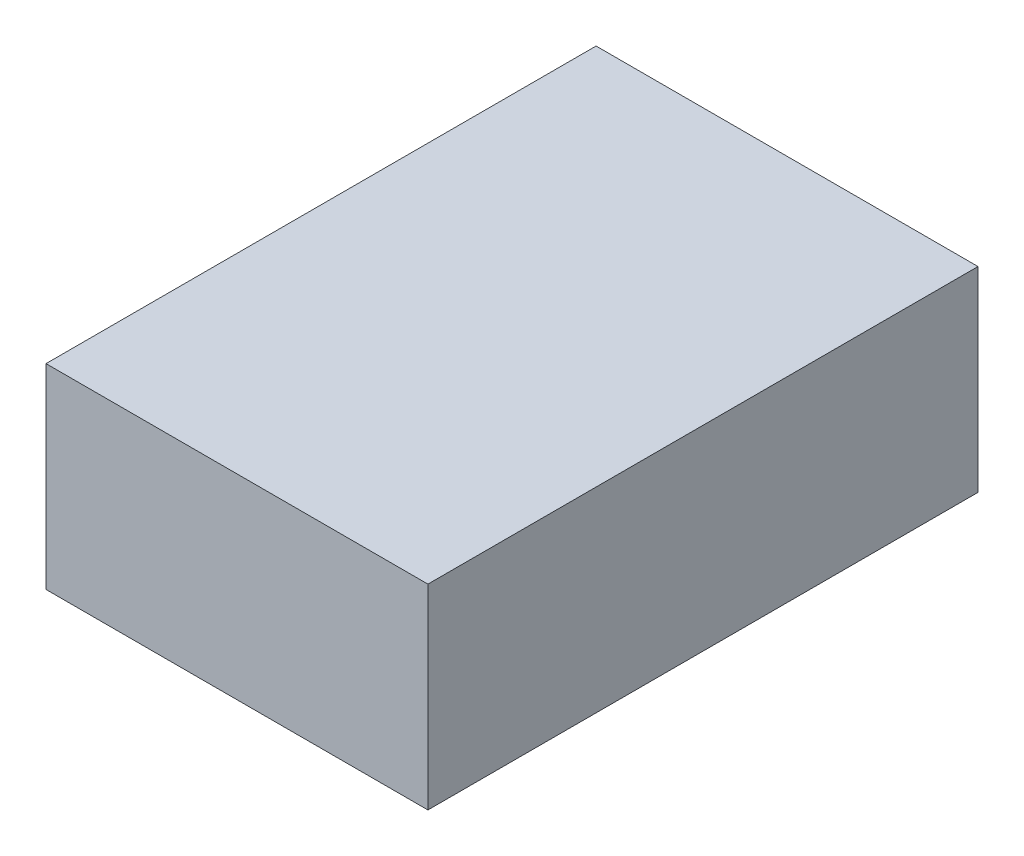
ISO-10303-21;
HEADER;
FILE_DESCRIPTION(('STEP AP214'),'2;1');
FILE_NAME('part.step','',(''),(''),'','','');
FILE_SCHEMA(('AUTOMOTIVE_DESIGN { 1 0 10303 214 1 1 1 1 }'));
ENDSEC;
DATA;
#1=APPLICATION_CONTEXT('core data for automotive mechanical design processes');
#2=APPLICATION_PROTOCOL_DEFINITION('international standard','automotive_design',2000,#1);
#3=PRODUCT_CONTEXT('',#1,'mechanical');
#4=PRODUCT('Part','Part','',(#3));
#5=PRODUCT_RELATED_PRODUCT_CATEGORY('part','',(#4));
#6=PRODUCT_DEFINITION_FORMATION('','',#4);
#7=PRODUCT_DEFINITION_CONTEXT('part definition',#1,'design');
#8=PRODUCT_DEFINITION('design','',#6,#7);
#9=PRODUCT_DEFINITION_SHAPE('','',#8);
#10=(LENGTH_UNIT() NAMED_UNIT(*) SI_UNIT(.MILLI.,.METRE.));
#11=(NAMED_UNIT(*) PLANE_ANGLE_UNIT() SI_UNIT($,.RADIAN.));
#12=(NAMED_UNIT(*) SI_UNIT($,.STERADIAN.) SOLID_ANGLE_UNIT());
#13=UNCERTAINTY_MEASURE_WITH_UNIT(LENGTH_MEASURE(1.E-05),#10,'distance_accuracy_value','');
#14=(GEOMETRIC_REPRESENTATION_CONTEXT(3) GLOBAL_UNCERTAINTY_ASSIGNED_CONTEXT((#13)) GLOBAL_UNIT_ASSIGNED_CONTEXT((#10,
#11,#12)) REPRESENTATION_CONTEXT('',''));
#15=CARTESIAN_POINT('',(0.,0.,0.));
#16=DIRECTION('',(0.,0.,1.));
#17=DIRECTION('',(1.,0.,0.));
#18=AXIS2_PLACEMENT_3D('',#15,#16,#17);
#19=CARTESIAN_POINT('',(-0.5207,0.2667,0.));
#20=DIRECTION('',(0.,1.,0.));
#21=DIRECTION('',(1.,0.,0.));
#22=AXIS2_PLACEMENT_3D('',#19,#20,#21);
#23=PLANE('',#22);
#24=DIRECTION('',(0.,0.,-1.));
#25=VECTOR('',#24,1.);
#26=CARTESIAN_POINT('',(0.5207,0.2667,0.));
#27=LINE('',#26,#25);
#28=CARTESIAN_POINT('',(0.5207,0.2667,1.5));
#29=VERTEX_POINT('',#28);
#30=CARTESIAN_POINT('',(0.5207,0.2667,0.));
#31=VERTEX_POINT('',#30);
#32=EDGE_CURVE('E27',#29,#31,#27,.T.);
#33=ORIENTED_EDGE('',*,*,#32,.T.);
#34=DIRECTION('',(-1.,0.,0.));
#35=VECTOR('',#34,1.);
#36=CARTESIAN_POINT('',(-0.5207,0.2667,0.));
#37=LINE('',#36,#35);
#38=CARTESIAN_POINT('',(-0.5207,0.2667,0.));
#39=VERTEX_POINT('',#38);
#40=EDGE_CURVE('E11',#31,#39,#37,.T.);
#41=ORIENTED_EDGE('',*,*,#40,.T.);
#42=DIRECTION('',(0.,0.,1.));
#43=VECTOR('',#42,1.);
#44=CARTESIAN_POINT('',(-0.5207,0.2667,0.));
#45=LINE('',#44,#43);
#46=CARTESIAN_POINT('',(-0.5207,0.2667,1.5));
#47=VERTEX_POINT('',#46);
#48=EDGE_CURVE('E70',#39,#47,#45,.T.);
#49=ORIENTED_EDGE('',*,*,#48,.T.);
#50=DIRECTION('',(1.,0.,0.));
#51=VECTOR('',#50,1.);
#52=CARTESIAN_POINT('',(-0.5207,0.2667,1.5));
#53=LINE('',#52,#51);
#54=EDGE_CURVE('E125',#47,#29,#53,.T.);
#55=ORIENTED_EDGE('',*,*,#54,.T.);
#56=EDGE_LOOP('',(#33,#41,#49,#55));
#57=FACE_BOUND('',#56,.T.);
#58=ADVANCED_FACE('F16',(#57),#23,.T.);
#59=CARTESIAN_POINT('',(-0.5207,-0.2667,0.));
#60=DIRECTION('',(0.,0.,1.));
#61=DIRECTION('',(1.,0.,0.));
#62=AXIS2_PLACEMENT_3D('',#59,#60,#61);
#63=PLANE('',#62);
#64=ORIENTED_EDGE('',*,*,#40,.F.);
#65=DIRECTION('',(0.,1.,0.));
#66=VECTOR('',#65,1.);
#67=CARTESIAN_POINT('',(0.5207,-0.2667,0.));
#68=LINE('',#67,#66);
#69=CARTESIAN_POINT('',(0.5207,-0.2667,0.));
#70=VERTEX_POINT('',#69);
#71=EDGE_CURVE('E78',#70,#31,#68,.T.);
#72=ORIENTED_EDGE('',*,*,#71,.F.);
#73=DIRECTION('',(1.,0.,0.));
#74=VECTOR('',#73,1.);
#75=CARTESIAN_POINT('',(-0.5207,-0.2667,0.));
#76=LINE('',#75,#74);
#77=CARTESIAN_POINT('',(-0.5207,-0.2667,0.));
#78=VERTEX_POINT('',#77);
#79=EDGE_CURVE('E75',#78,#70,#76,.T.);
#80=ORIENTED_EDGE('',*,*,#79,.F.);
#81=DIRECTION('',(0.,-1.,0.));
#82=VECTOR('',#81,1.);
#83=CARTESIAN_POINT('',(-0.5207,-0.2667,0.));
#84=LINE('',#83,#82);
#85=EDGE_CURVE('E64',#39,#78,#84,.T.);
#86=ORIENTED_EDGE('',*,*,#85,.F.);
#87=EDGE_LOOP('',(#64,#72,#80,#86));
#88=FACE_BOUND('',#87,.T.);
#89=ADVANCED_FACE('F76',(#88),#63,.F.);
#90=CARTESIAN_POINT('',(0.5207,0.2667,0.));
#91=DIRECTION('',(1.,0.,0.));
#92=DIRECTION('',(0.,1.,0.));
#93=AXIS2_PLACEMENT_3D('',#90,#91,#92);
#94=PLANE('',#93);
#95=DIRECTION('',(0.,0.,-1.));
#96=VECTOR('',#95,1.);
#97=CARTESIAN_POINT('',(0.5207,-0.2667,0.));
#98=LINE('',#97,#96);
#99=CARTESIAN_POINT('',(0.5207,-0.2667,1.5));
#100=VERTEX_POINT('',#99);
#101=EDGE_CURVE('E83',#100,#70,#98,.T.);
#102=ORIENTED_EDGE('',*,*,#101,.T.);
#103=ORIENTED_EDGE('',*,*,#71,.T.);
#104=ORIENTED_EDGE('',*,*,#32,.F.);
#105=DIRECTION('',(0.,-1.,0.));
#106=VECTOR('',#105,1.);
#107=CARTESIAN_POINT('',(0.5207,0.2667,1.5));
#108=LINE('',#107,#106);
#109=EDGE_CURVE('E131',#29,#100,#108,.T.);
#110=ORIENTED_EDGE('',*,*,#109,.T.);
#111=EDGE_LOOP('',(#102,#103,#104,#110));
#112=FACE_BOUND('',#111,.T.);
#113=ADVANCED_FACE('F18',(#112),#94,.T.);
#114=CARTESIAN_POINT('',(-0.5207,-0.2667,1.5));
#115=DIRECTION('',(0.,0.,1.));
#116=DIRECTION('',(1.,0.,0.));
#117=AXIS2_PLACEMENT_3D('',#114,#115,#116);
#118=PLANE('',#117);
#119=ORIENTED_EDGE('',*,*,#54,.F.);
#120=DIRECTION('',(0.,-1.,0.));
#121=VECTOR('',#120,1.);
#122=CARTESIAN_POINT('',(-0.5207,-0.2667,1.5));
#123=LINE('',#122,#121);
#124=CARTESIAN_POINT('',(-0.5207,-0.2667,1.5));
#125=VERTEX_POINT('',#124);
#126=EDGE_CURVE('E72',#47,#125,#123,.T.);
#127=ORIENTED_EDGE('',*,*,#126,.T.);
#128=DIRECTION('',(1.,0.,0.));
#129=VECTOR('',#128,1.);
#130=CARTESIAN_POINT('',(-0.5207,-0.2667,1.5));
#131=LINE('',#130,#129);
#132=EDGE_CURVE('E88',#125,#100,#131,.T.);
#133=ORIENTED_EDGE('',*,*,#132,.T.);
#134=ORIENTED_EDGE('',*,*,#109,.F.);
#135=EDGE_LOOP('',(#119,#127,#133,#134));
#136=FACE_BOUND('',#135,.T.);
#137=ADVANCED_FACE('F165',(#136),#118,.T.);
#138=CARTESIAN_POINT('',(-0.5207,-0.2667,0.));
#139=DIRECTION('',(-1.,0.,0.));
#140=DIRECTION('',(0.,0.,1.));
#141=AXIS2_PLACEMENT_3D('',#138,#139,#140);
#142=PLANE('',#141);
#143=ORIENTED_EDGE('',*,*,#48,.F.);
#144=ORIENTED_EDGE('',*,*,#85,.T.);
#145=DIRECTION('',(0.,0.,1.));
#146=VECTOR('',#145,1.);
#147=CARTESIAN_POINT('',(-0.5207,-0.2667,0.));
#148=LINE('',#147,#146);
#149=EDGE_CURVE('E20',#78,#125,#148,.T.);
#150=ORIENTED_EDGE('',*,*,#149,.T.);
#151=ORIENTED_EDGE('',*,*,#126,.F.);
#152=EDGE_LOOP('',(#143,#144,#150,#151));
#153=FACE_BOUND('',#152,.T.);
#154=ADVANCED_FACE('F66',(#153),#142,.T.);
#155=CARTESIAN_POINT('',(0.5207,-0.2667,0.));
#156=DIRECTION('',(0.,-1.,0.));
#157=DIRECTION('',(0.,0.,-1.));
#158=AXIS2_PLACEMENT_3D('',#155,#156,#157);
#159=PLANE('',#158);
#160=ORIENTED_EDGE('',*,*,#149,.F.);
#161=ORIENTED_EDGE('',*,*,#79,.T.);
#162=ORIENTED_EDGE('',*,*,#101,.F.);
#163=ORIENTED_EDGE('',*,*,#132,.F.);
#164=EDGE_LOOP('',(#160,#161,#162,#163));
#165=FACE_BOUND('',#164,.T.);
#166=ADVANCED_FACE('F86',(#165),#159,.T.);
#167=CLOSED_SHELL('',(#58,#89,#113,#137,#154,#166));
#168=MANIFOLD_SOLID_BREP('B1',#167);
#169=ADVANCED_BREP_SHAPE_REPRESENTATION('',(#18,#168),#14);
#170=SHAPE_DEFINITION_REPRESENTATION(#9,#169);
ENDSEC;
END-ISO-10303-21;
